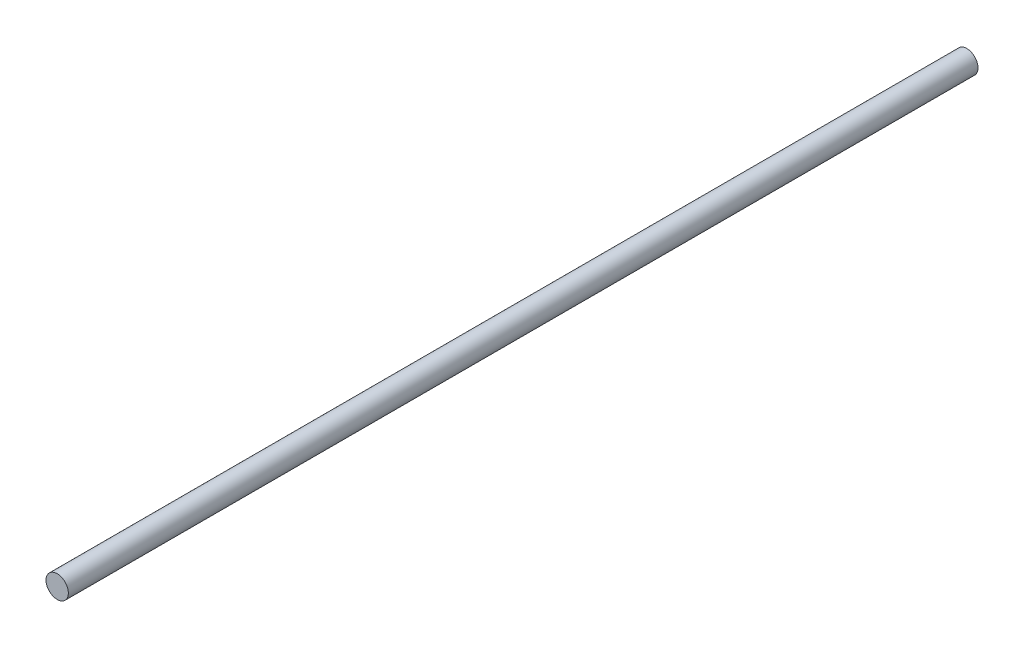
ISO-10303-21;
HEADER;
FILE_DESCRIPTION(('STEP AP214'),'2;1');
FILE_NAME('part.step','',(''),(''),'','','');
FILE_SCHEMA(('AUTOMOTIVE_DESIGN { 1 0 10303 214 1 1 1 1 }'));
ENDSEC;
DATA;
#1=APPLICATION_CONTEXT('core data for automotive mechanical design processes');
#2=APPLICATION_PROTOCOL_DEFINITION('international standard','automotive_design',2000,#1);
#3=PRODUCT_CONTEXT('',#1,'mechanical');
#4=PRODUCT('Part','Part','',(#3));
#5=PRODUCT_RELATED_PRODUCT_CATEGORY('part','',(#4));
#6=PRODUCT_DEFINITION_FORMATION('','',#4);
#7=PRODUCT_DEFINITION_CONTEXT('part definition',#1,'design');
#8=PRODUCT_DEFINITION('design','',#6,#7);
#9=PRODUCT_DEFINITION_SHAPE('','',#8);
#10=(LENGTH_UNIT() NAMED_UNIT(*) SI_UNIT(.MILLI.,.METRE.));
#11=(NAMED_UNIT(*) PLANE_ANGLE_UNIT() SI_UNIT($,.RADIAN.));
#12=(NAMED_UNIT(*) SI_UNIT($,.STERADIAN.) SOLID_ANGLE_UNIT());
#13=UNCERTAINTY_MEASURE_WITH_UNIT(LENGTH_MEASURE(1.E-05),#10,'distance_accuracy_value','');
#14=(GEOMETRIC_REPRESENTATION_CONTEXT(3) GLOBAL_UNCERTAINTY_ASSIGNED_CONTEXT((#13)) GLOBAL_UNIT_ASSIGNED_CONTEXT((#10,
#11,#12)) REPRESENTATION_CONTEXT('',''));
#15=CARTESIAN_POINT('',(0.,0.,0.));
#16=DIRECTION('',(0.,0.,1.));
#17=DIRECTION('',(1.,0.,0.));
#18=AXIS2_PLACEMENT_3D('',#15,#16,#17);
#19=CARTESIAN_POINT('',(0.,0.,488.));
#20=DIRECTION('',(0.,0.,-1.));
#21=DIRECTION('',(-1.,0.,0.));
#22=AXIS2_PLACEMENT_3D('',#19,#20,#21);
#23=CYLINDRICAL_SURFACE('',#22,6.);
#24=CARTESIAN_POINT('',(0.,0.,488.));
#25=DIRECTION('',(0.,0.,1.));
#26=DIRECTION('',(1.,0.,0.));
#27=AXIS2_PLACEMENT_3D('',#24,#25,#26);
#28=CIRCLE('',#27,6.);
#29=CARTESIAN_POINT('',(-6.,0.,488.));
#30=VERTEX_POINT('',#29);
#31=EDGE_CURVE('E10',#30,#30,#28,.T.);
#32=CARTESIAN_POINT('',(0.,0.,0.));
#33=DIRECTION('',(0.,0.,1.));
#34=DIRECTION('',(1.,0.,0.));
#35=AXIS2_PLACEMENT_3D('',#32,#33,#34);
#36=CIRCLE('',#35,6.);
#37=CARTESIAN_POINT('',(-6.,0.,0.));
#38=VERTEX_POINT('',#37);
#39=EDGE_CURVE('E34',#38,#38,#36,.T.);
#40=CARTESIAN_POINT('',(-6.,0.,488.));
#41=CARTESIAN_POINT('',(-6.,0.,482.916666666667));
#42=CARTESIAN_POINT('',(-6.,0.,477.833333333333));
#43=CARTESIAN_POINT('',(-6.,0.,467.666666666667));
#44=CARTESIAN_POINT('',(-6.,0.,462.583333333333));
#45=CARTESIAN_POINT('',(-6.,0.,452.416666666667));
#46=CARTESIAN_POINT('',(-6.,0.,447.333333333333));
#47=CARTESIAN_POINT('',(-6.,0.,437.166666666667));
#48=CARTESIAN_POINT('',(-6.,0.,432.083333333333));
#49=CARTESIAN_POINT('',(-6.,0.,421.916666666667));
#50=CARTESIAN_POINT('',(-6.,0.,416.833333333333));
#51=CARTESIAN_POINT('',(-6.,0.,406.666666666667));
#52=CARTESIAN_POINT('',(-6.,0.,401.583333333333));
#53=CARTESIAN_POINT('',(-6.,0.,391.416666666667));
#54=CARTESIAN_POINT('',(-6.,0.,386.333333333333));
#55=CARTESIAN_POINT('',(-6.,0.,376.166666666667));
#56=CARTESIAN_POINT('',(-6.,0.,371.083333333333));
#57=CARTESIAN_POINT('',(-6.,0.,360.916666666667));
#58=CARTESIAN_POINT('',(-6.,0.,355.833333333333));
#59=CARTESIAN_POINT('',(-6.,0.,345.666666666667));
#60=CARTESIAN_POINT('',(-6.,0.,340.583333333333));
#61=CARTESIAN_POINT('',(-6.,0.,330.416666666667));
#62=CARTESIAN_POINT('',(-6.,0.,325.333333333333));
#63=CARTESIAN_POINT('',(-6.,0.,315.166666666667));
#64=CARTESIAN_POINT('',(-6.,0.,310.083333333333));
#65=CARTESIAN_POINT('',(-6.,0.,299.916666666667));
#66=CARTESIAN_POINT('',(-6.,0.,294.833333333333));
#67=CARTESIAN_POINT('',(-6.,0.,284.666666666667));
#68=CARTESIAN_POINT('',(-6.,0.,279.583333333333));
#69=CARTESIAN_POINT('',(-6.,0.,269.416666666667));
#70=CARTESIAN_POINT('',(-6.,0.,264.333333333333));
#71=CARTESIAN_POINT('',(-6.,0.,254.166666666667));
#72=CARTESIAN_POINT('',(-6.,0.,249.083333333333));
#73=CARTESIAN_POINT('',(-6.,0.,238.916666666667));
#74=CARTESIAN_POINT('',(-6.,0.,233.833333333333));
#75=CARTESIAN_POINT('',(-6.,0.,223.666666666667));
#76=CARTESIAN_POINT('',(-6.,0.,218.583333333333));
#77=CARTESIAN_POINT('',(-6.,0.,208.416666666667));
#78=CARTESIAN_POINT('',(-6.,0.,203.333333333333));
#79=CARTESIAN_POINT('',(-6.,0.,193.166666666667));
#80=CARTESIAN_POINT('',(-6.,0.,188.083333333333));
#81=CARTESIAN_POINT('',(-6.,0.,177.916666666667));
#82=CARTESIAN_POINT('',(-6.,0.,172.833333333333));
#83=CARTESIAN_POINT('',(-6.,0.,162.666666666667));
#84=CARTESIAN_POINT('',(-6.,0.,157.583333333333));
#85=CARTESIAN_POINT('',(-6.,0.,147.416666666667));
#86=CARTESIAN_POINT('',(-6.,0.,142.333333333333));
#87=CARTESIAN_POINT('',(-6.,0.,132.166666666667));
#88=CARTESIAN_POINT('',(-6.,0.,127.083333333333));
#89=CARTESIAN_POINT('',(-6.,0.,116.916666666667));
#90=CARTESIAN_POINT('',(-6.,0.,111.833333333333));
#91=CARTESIAN_POINT('',(-6.,0.,101.666666666667));
#92=CARTESIAN_POINT('',(-6.,0.,96.5833333333333));
#93=CARTESIAN_POINT('',(-6.,0.,86.4166666666666));
#94=CARTESIAN_POINT('',(-6.,0.,81.3333333333333));
#95=CARTESIAN_POINT('',(-6.,0.,71.1666666666666));
#96=CARTESIAN_POINT('',(-6.,0.,66.0833333333333));
#97=CARTESIAN_POINT('',(-6.,0.,55.9166666666666));
#98=CARTESIAN_POINT('',(-6.,0.,50.8333333333333));
#99=CARTESIAN_POINT('',(-6.,0.,40.6666666666666));
#100=CARTESIAN_POINT('',(-6.,0.,35.5833333333333));
#101=CARTESIAN_POINT('',(-6.,0.,25.4166666666666));
#102=CARTESIAN_POINT('',(-6.,0.,20.3333333333333));
#103=CARTESIAN_POINT('',(-6.,0.,10.1666666666666));
#104=CARTESIAN_POINT('',(-6.,0.,5.08333333333327));
#105=CARTESIAN_POINT('',(-6.,0.,0.));
#106=B_SPLINE_CURVE_WITH_KNOTS('',3,(#40,#41,#42,#43,#44,#45,#46,#47,#48,#49,#50,#51,#52,#53,
#54,#55,#56,#57,#58,#59,#60,#61,#62,#63,#64,#65,#66,#67,#68,#69,#70,#71,#72,#73,#74,#75,#76,#77,
#78,#79,#80,#81,#82,#83,#84,#85,#86,#87,#88,#89,#90,#91,#92,#93,#94,#95,#96,#97,#98,#99,#100,
#101,#102,#103,#104,#105),.UNSPECIFIED.,.F.,.F.,(4,2,2,2,2,2,2,2,2,2,2,2,2,2,2,2,2,2,2,2,2,2,2,
2,2,2,2,2,2,2,2,2,4),(0.,15.25,30.5,45.75,61.,76.25,91.5,106.75,122.,137.25,152.5,167.75,183.,
198.25,213.5,228.75,244.,259.25,274.5,289.75,305.,320.25,335.5,350.75,366.,381.25,396.5,411.75,
427.,442.25,457.5,472.75,488.),.UNSPECIFIED.);
#107=EDGE_CURVE('BSEAM31',#30,#38,#106,.T.);
#108=ORIENTED_EDGE('',*,*,#31,.F.);
#109=ORIENTED_EDGE('',*,*,#39,.T.);
#110=ORIENTED_EDGE('',*,*,#107,.T.);
#111=ORIENTED_EDGE('',*,*,#107,.F.);
#112=EDGE_LOOP('',(#108,#110,#109,#111));
#113=FACE_BOUND('',#112,.T.);
#114=ADVANCED_FACE('F31',(#113),#23,.T.);
#115=CARTESIAN_POINT('',(0.,0.,488.));
#116=DIRECTION('',(0.,0.,1.));
#117=DIRECTION('',(1.,0.,0.));
#118=AXIS2_PLACEMENT_3D('',#115,#116,#117);
#119=PLANE('',#118);
#120=ORIENTED_EDGE('',*,*,#31,.T.);
#121=EDGE_LOOP('',(#120));
#122=FACE_BOUND('',#121,.T.);
#123=ADVANCED_FACE('F46',(#122),#119,.T.);
#124=CARTESIAN_POINT('',(0.,0.,0.));
#125=DIRECTION('',(0.,0.,1.));
#126=DIRECTION('',(1.,0.,0.));
#127=AXIS2_PLACEMENT_3D('',#124,#125,#126);
#128=PLANE('',#127);
#129=ORIENTED_EDGE('',*,*,#39,.F.);
#130=EDGE_LOOP('',(#129));
#131=FACE_BOUND('',#130,.T.);
#132=ADVANCED_FACE('F44',(#131),#128,.F.);
#133=CLOSED_SHELL('',(#114,#123,#132));
#134=MANIFOLD_SOLID_BREP('B2',#133);
#135=ADVANCED_BREP_SHAPE_REPRESENTATION('',(#18,#134),#14);
#136=SHAPE_DEFINITION_REPRESENTATION(#9,#135);
ENDSEC;
END-ISO-10303-21;
